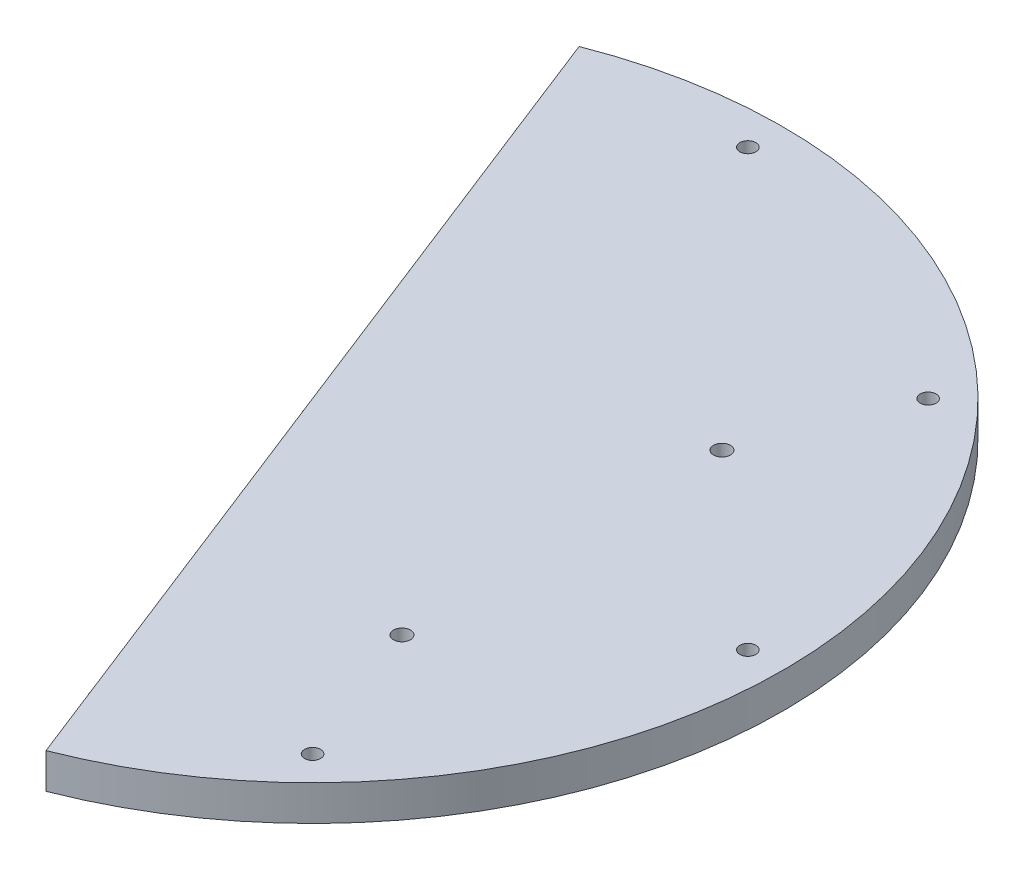
ISO-10303-21;
HEADER;
FILE_DESCRIPTION(('STEP AP214'),'2;1');
FILE_NAME('part.step','',(''),(''),'','','');
FILE_SCHEMA(('AUTOMOTIVE_DESIGN { 1 0 10303 214 1 1 1 1 }'));
ENDSEC;
DATA;
#1=APPLICATION_CONTEXT('core data for automotive mechanical design processes');
#2=APPLICATION_PROTOCOL_DEFINITION('international standard','automotive_design',2000,#1);
#3=PRODUCT_CONTEXT('',#1,'mechanical');
#4=PRODUCT('Part','Part','',(#3));
#5=PRODUCT_RELATED_PRODUCT_CATEGORY('part','',(#4));
#6=PRODUCT_DEFINITION_FORMATION('','',#4);
#7=PRODUCT_DEFINITION_CONTEXT('part definition',#1,'design');
#8=PRODUCT_DEFINITION('design','',#6,#7);
#9=PRODUCT_DEFINITION_SHAPE('','',#8);
#10=(LENGTH_UNIT() NAMED_UNIT(*) SI_UNIT(.MILLI.,.METRE.));
#11=(NAMED_UNIT(*) PLANE_ANGLE_UNIT() SI_UNIT($,.RADIAN.));
#12=(NAMED_UNIT(*) SI_UNIT($,.STERADIAN.) SOLID_ANGLE_UNIT());
#13=UNCERTAINTY_MEASURE_WITH_UNIT(LENGTH_MEASURE(1.E-05),#10,'distance_accuracy_value','');
#14=(GEOMETRIC_REPRESENTATION_CONTEXT(3) GLOBAL_UNCERTAINTY_ASSIGNED_CONTEXT((#13)) GLOBAL_UNIT_ASSIGNED_CONTEXT((#10,
#11,#12)) REPRESENTATION_CONTEXT('',''));
#15=CARTESIAN_POINT('',(0.,0.,0.));
#16=DIRECTION('',(0.,0.,1.));
#17=DIRECTION('',(1.,0.,0.));
#18=AXIS2_PLACEMENT_3D('',#15,#16,#17);
#19=CARTESIAN_POINT('',(0.,0.,0.));
#20=DIRECTION('',(0.,1.,0.));
#21=DIRECTION('',(0.,0.,1.));
#22=AXIS2_PLACEMENT_3D('',#19,#20,#21);
#23=PLANE('',#22);
#24=CARTESIAN_POINT('',(53.,0.,34.));
#25=DIRECTION('',(0.,-1.,0.));
#26=DIRECTION('',(0.,0.,-1.));
#27=AXIS2_PLACEMENT_3D('',#24,#25,#26);
#28=CIRCLE('',#27,3.25);
#29=CARTESIAN_POINT('',(53.,0.,30.75));
#30=VERTEX_POINT('',#29);
#31=EDGE_CURVE('E128',#30,#30,#28,.T.);
#32=ORIENTED_EDGE('',*,*,#31,.F.);
#33=EDGE_LOOP('',(#32));
#34=FACE_BOUND('',#33,.T.);
#35=CARTESIAN_POINT('',(-6.45005562586619E-13,0.,-92.5));
#36=DIRECTION('',(0.,-1.,0.));
#37=DIRECTION('',(0.,0.,-1.));
#38=AXIS2_PLACEMENT_3D('',#35,#36,#37);
#39=CIRCLE('',#38,3.25);
#40=CARTESIAN_POINT('',(-6.45005562586619E-13,0.,-95.75));
#41=VERTEX_POINT('',#40);
#42=EDGE_CURVE('E80',#41,#41,#39,.T.);
#43=ORIENTED_EDGE('',*,*,#42,.F.);
#44=EDGE_LOOP('',(#43));
#45=FACE_BOUND('',#44,.T.);
#46=CARTESIAN_POINT('',(65.4073772597553,0.,-65.407377259756));
#47=DIRECTION('',(0.,-1.,0.));
#48=DIRECTION('',(0.,0.,-1.));
#49=AXIS2_PLACEMENT_3D('',#46,#47,#48);
#50=CIRCLE('',#49,3.25);
#51=CARTESIAN_POINT('',(65.4073772597553,0.,-68.657377259756));
#52=VERTEX_POINT('',#51);
#53=EDGE_CURVE('E92',#52,#52,#50,.T.);
#54=ORIENTED_EDGE('',*,*,#53,.F.);
#55=EDGE_LOOP('',(#54));
#56=FACE_BOUND('',#55,.T.);
#57=CARTESIAN_POINT('',(92.5,0.,-3.22043538743629E-13));
#58=DIRECTION('',(0.,-1.,0.));
#59=DIRECTION('',(0.,0.,-1.));
#60=AXIS2_PLACEMENT_3D('',#57,#58,#59);
#61=CIRCLE('',#60,3.25);
#62=CARTESIAN_POINT('',(92.5,0.,-3.25000000000033));
#63=VERTEX_POINT('',#62);
#64=EDGE_CURVE('E104',#63,#63,#61,.T.);
#65=ORIENTED_EDGE('',*,*,#64,.F.);
#66=EDGE_LOOP('',(#65));
#67=FACE_BOUND('',#66,.T.);
#68=CARTESIAN_POINT('',(65.4073772597558,0.,65.4073772597555));
#69=DIRECTION('',(0.,-1.,0.));
#70=DIRECTION('',(0.,0.,-1.));
#71=AXIS2_PLACEMENT_3D('',#68,#69,#70);
#72=CIRCLE('',#71,3.25);
#73=CARTESIAN_POINT('',(65.4073772597558,0.,62.1573772597555));
#74=VERTEX_POINT('',#73);
#75=EDGE_CURVE('E116',#74,#74,#72,.T.);
#76=ORIENTED_EDGE('',*,*,#75,.F.);
#77=EDGE_LOOP('',(#76));
#78=FACE_BOUND('',#77,.T.);
#79=CARTESIAN_POINT('',(53.,0.,-34.));
#80=DIRECTION('',(0.,-1.,0.));
#81=DIRECTION('',(0.,0.,-1.));
#82=AXIS2_PLACEMENT_3D('',#79,#80,#81);
#83=CIRCLE('',#82,3.25);
#84=CARTESIAN_POINT('',(53.,0.,-37.25));
#85=VERTEX_POINT('',#84);
#86=EDGE_CURVE('E140',#85,#85,#83,.T.);
#87=ORIENTED_EDGE('',*,*,#86,.F.);
#88=EDGE_LOOP('',(#87));
#89=FACE_BOUND('',#88,.T.);
#90=DIRECTION('',(0.364698084371753,0.,0.931125827831864));
#91=VECTOR('',#90,1.);
#92=CARTESIAN_POINT('',(0.,0.,0.));
#93=LINE('',#92,#91);
#94=CARTESIAN_POINT('',(-36.4698084371753,0.,-93.1125827831864));
#95=VERTEX_POINT('',#94);
#96=CARTESIAN_POINT('',(36.4698084371753,0.,93.1125827831864));
#97=VERTEX_POINT('',#96);
#98=EDGE_CURVE('E66',#95,#97,#93,.T.);
#99=ORIENTED_EDGE('',*,*,#98,.F.);
#100=CARTESIAN_POINT('',(0.,0.,0.));
#101=DIRECTION('',(0.,1.,0.));
#102=DIRECTION('',(0.,0.,1.));
#103=AXIS2_PLACEMENT_3D('',#100,#101,#102);
#104=CIRCLE('',#103,100.);
#105=EDGE_CURVE('E65',#97,#95,#104,.T.);
#106=ORIENTED_EDGE('',*,*,#105,.F.);
#107=EDGE_LOOP('',(#99,#106));
#108=FACE_BOUND('',#107,.T.);
#109=ADVANCED_FACE('F33',(#34,#45,#56,#67,#78,#89,#108),#23,.F.);
#110=CARTESIAN_POINT('',(0.,7.5,0.));
#111=DIRECTION('',(0.,-1.,0.));
#112=DIRECTION('',(0.,0.,-1.));
#113=AXIS2_PLACEMENT_3D('',#110,#111,#112);
#114=CYLINDRICAL_SURFACE('',#113,100.);
#115=DIRECTION('',(0.,-1.,0.));
#116=VECTOR('',#115,1.);
#117=CARTESIAN_POINT('',(-36.4698084371753,7.5,-93.1125827831864));
#118=LINE('',#117,#116);
#119=CARTESIAN_POINT('',(-36.4698084371753,7.5,-93.1125827831864));
#120=VERTEX_POINT('',#119);
#121=EDGE_CURVE('E52',#120,#95,#118,.T.);
#122=ORIENTED_EDGE('',*,*,#121,.F.);
#123=CARTESIAN_POINT('',(0.,7.5,0.));
#124=DIRECTION('',(0.,1.,0.));
#125=DIRECTION('',(0.,0.,1.));
#126=AXIS2_PLACEMENT_3D('',#123,#124,#125);
#127=CIRCLE('',#126,100.);
#128=CARTESIAN_POINT('',(36.4698084371753,7.5,93.1125827831864));
#129=VERTEX_POINT('',#128);
#130=EDGE_CURVE('E41',#129,#120,#127,.T.);
#131=ORIENTED_EDGE('',*,*,#130,.F.);
#132=DIRECTION('',(0.,-1.,0.));
#133=VECTOR('',#132,1.);
#134=CARTESIAN_POINT('',(36.4698084371753,7.5,93.1125827831864));
#135=LINE('',#134,#133);
#136=EDGE_CURVE('E48',#97,#129,#135,.F.);
#137=ORIENTED_EDGE('',*,*,#136,.F.);
#138=ORIENTED_EDGE('',*,*,#105,.T.);
#139=EDGE_LOOP('',(#122,#131,#137,#138));
#140=FACE_BOUND('',#139,.T.);
#141=ADVANCED_FACE('F63',(#140),#114,.T.);
#142=CARTESIAN_POINT('',(0.,7.5,0.));
#143=DIRECTION('',(0.,1.,0.));
#144=DIRECTION('',(0.,0.,1.));
#145=AXIS2_PLACEMENT_3D('',#142,#143,#144);
#146=PLANE('',#145);
#147=CARTESIAN_POINT('',(-6.45005562586619E-13,7.5,-92.5));
#148=DIRECTION('',(0.,-1.,0.));
#149=DIRECTION('',(0.,0.,-1.));
#150=AXIS2_PLACEMENT_3D('',#147,#148,#149);
#151=CIRCLE('',#150,1.7);
#152=CARTESIAN_POINT('',(-6.45005562586619E-13,7.5,-94.2));
#153=VERTEX_POINT('',#152);
#154=EDGE_CURVE('E70',#153,#153,#151,.T.);
#155=ORIENTED_EDGE('',*,*,#154,.T.);
#156=EDGE_LOOP('',(#155));
#157=FACE_BOUND('',#156,.T.);
#158=CARTESIAN_POINT('',(65.4073772597553,7.5,-65.407377259756));
#159=DIRECTION('',(0.,-1.,0.));
#160=DIRECTION('',(0.,0.,-1.));
#161=AXIS2_PLACEMENT_3D('',#158,#159,#160);
#162=CIRCLE('',#161,1.69999999999999);
#163=CARTESIAN_POINT('',(65.4073772597553,7.5,-67.107377259756));
#164=VERTEX_POINT('',#163);
#165=EDGE_CURVE('E83',#164,#164,#162,.T.);
#166=ORIENTED_EDGE('',*,*,#165,.T.);
#167=EDGE_LOOP('',(#166));
#168=FACE_BOUND('',#167,.T.);
#169=CARTESIAN_POINT('',(92.5,7.5,-3.22043538743629E-13));
#170=DIRECTION('',(0.,-1.,0.));
#171=DIRECTION('',(0.,0.,-1.));
#172=AXIS2_PLACEMENT_3D('',#169,#170,#171);
#173=CIRCLE('',#172,1.69999999999999);
#174=CARTESIAN_POINT('',(92.5,7.5,-1.70000000000032));
#175=VERTEX_POINT('',#174);
#176=EDGE_CURVE('E95',#175,#175,#173,.T.);
#177=ORIENTED_EDGE('',*,*,#176,.T.);
#178=EDGE_LOOP('',(#177));
#179=FACE_BOUND('',#178,.T.);
#180=CARTESIAN_POINT('',(65.4073772597558,7.5,65.4073772597555));
#181=DIRECTION('',(0.,-1.,0.));
#182=DIRECTION('',(0.,0.,-1.));
#183=AXIS2_PLACEMENT_3D('',#180,#181,#182);
#184=CIRCLE('',#183,1.69999999999999);
#185=CARTESIAN_POINT('',(65.4073772597558,7.5,63.7073772597555));
#186=VERTEX_POINT('',#185);
#187=EDGE_CURVE('E107',#186,#186,#184,.T.);
#188=ORIENTED_EDGE('',*,*,#187,.T.);
#189=EDGE_LOOP('',(#188));
#190=FACE_BOUND('',#189,.T.);
#191=CARTESIAN_POINT('',(53.,7.5,34.));
#192=DIRECTION('',(0.,-1.,0.));
#193=DIRECTION('',(0.,0.,-1.));
#194=AXIS2_PLACEMENT_3D('',#191,#192,#193);
#195=CIRCLE('',#194,1.8);
#196=CARTESIAN_POINT('',(53.,7.5,32.2));
#197=VERTEX_POINT('',#196);
#198=EDGE_CURVE('E119',#197,#197,#195,.T.);
#199=ORIENTED_EDGE('',*,*,#198,.T.);
#200=EDGE_LOOP('',(#199));
#201=FACE_BOUND('',#200,.T.);
#202=CARTESIAN_POINT('',(53.,7.5,-34.));
#203=DIRECTION('',(0.,-1.,0.));
#204=DIRECTION('',(0.,0.,-1.));
#205=AXIS2_PLACEMENT_3D('',#202,#203,#204);
#206=CIRCLE('',#205,1.8);
#207=CARTESIAN_POINT('',(53.,7.5,-35.8));
#208=VERTEX_POINT('',#207);
#209=EDGE_CURVE('E131',#208,#208,#206,.T.);
#210=ORIENTED_EDGE('',*,*,#209,.T.);
#211=EDGE_LOOP('',(#210));
#212=FACE_BOUND('',#211,.T.);
#213=ORIENTED_EDGE('',*,*,#130,.T.);
#214=DIRECTION('',(0.364698084371753,0.,0.931125827831864));
#215=VECTOR('',#214,1.);
#216=CARTESIAN_POINT('',(0.,7.5,0.));
#217=LINE('',#216,#215);
#218=EDGE_CURVE('E11',#120,#129,#217,.T.);
#219=ORIENTED_EDGE('',*,*,#218,.T.);
#220=EDGE_LOOP('',(#213,#219));
#221=FACE_BOUND('',#220,.T.);
#222=ADVANCED_FACE('F68',(#157,#168,#179,#190,#201,#212,#221),#146,.T.);
#223=CARTESIAN_POINT('',(-6.45005562586619E-13,0.,-92.5));
#224=DIRECTION('',(0.,-1.,0.));
#225=DIRECTION('',(0.,0.,-1.));
#226=AXIS2_PLACEMENT_3D('',#223,#224,#225);
#227=CYLINDRICAL_SURFACE('',#226,1.7);
#228=ORIENTED_EDGE('',*,*,#154,.F.);
#229=EDGE_LOOP('',(#228));
#230=FACE_BOUND('',#229,.T.);
#231=CARTESIAN_POINT('',(-6.45005562586619E-13,3.,-92.5));
#232=DIRECTION('',(0.,-1.,0.));
#233=DIRECTION('',(0.,0.,-1.));
#234=AXIS2_PLACEMENT_3D('',#231,#232,#233);
#235=CIRCLE('',#234,1.7);
#236=CARTESIAN_POINT('',(-6.45005562586619E-13,3.,-94.2));
#237=VERTEX_POINT('',#236);
#238=EDGE_CURVE('E74',#237,#237,#235,.T.);
#239=ORIENTED_EDGE('',*,*,#238,.T.);
#240=EDGE_LOOP('',(#239));
#241=FACE_BOUND('',#240,.T.);
#242=ADVANCED_FACE('F253',(#230,#241),#227,.F.);
#243=CARTESIAN_POINT('',(1.69999999999935,3.,-92.5));
#244=DIRECTION('',(0.,1.,0.));
#245=DIRECTION('',(0.,0.,1.));
#246=AXIS2_PLACEMENT_3D('',#243,#244,#245);
#247=PLANE('',#246);
#248=ORIENTED_EDGE('',*,*,#238,.F.);
#249=EDGE_LOOP('',(#248));
#250=FACE_BOUND('',#249,.T.);
#251=CARTESIAN_POINT('',(-6.45005562586619E-13,3.,-92.5));
#252=DIRECTION('',(0.,-1.,0.));
#253=DIRECTION('',(0.,0.,-1.));
#254=AXIS2_PLACEMENT_3D('',#251,#252,#253);
#255=CIRCLE('',#254,3.25);
#256=CARTESIAN_POINT('',(-6.45005562586619E-13,3.,-95.75));
#257=VERTEX_POINT('',#256);
#258=EDGE_CURVE('E77',#257,#257,#255,.T.);
#259=ORIENTED_EDGE('',*,*,#258,.T.);
#260=EDGE_LOOP('',(#259));
#261=FACE_BOUND('',#260,.T.);
#262=ADVANCED_FACE('F396',(#250,#261),#247,.F.);
#263=CARTESIAN_POINT('',(-6.45005562586619E-13,0.,-92.5));
#264=DIRECTION('',(0.,-1.,0.));
#265=DIRECTION('',(0.,0.,-1.));
#266=AXIS2_PLACEMENT_3D('',#263,#264,#265);
#267=CYLINDRICAL_SURFACE('',#266,3.25);
#268=ORIENTED_EDGE('',*,*,#258,.F.);
#269=EDGE_LOOP('',(#268));
#270=FACE_BOUND('',#269,.T.);
#271=ORIENTED_EDGE('',*,*,#42,.T.);
#272=EDGE_LOOP('',(#271));
#273=FACE_BOUND('',#272,.T.);
#274=ADVANCED_FACE('F387',(#270,#273),#267,.F.);
#275=CARTESIAN_POINT('',(65.4073772597553,0.,-65.407377259756));
#276=DIRECTION('',(0.,-1.,0.));
#277=DIRECTION('',(0.,0.,-1.));
#278=AXIS2_PLACEMENT_3D('',#275,#276,#277);
#279=CYLINDRICAL_SURFACE('',#278,1.69999999999999);
#280=ORIENTED_EDGE('',*,*,#165,.F.);
#281=EDGE_LOOP('',(#280));
#282=FACE_BOUND('',#281,.T.);
#283=CARTESIAN_POINT('',(65.4073772597553,3.,-65.407377259756));
#284=DIRECTION('',(0.,-1.,0.));
#285=DIRECTION('',(0.,0.,-1.));
#286=AXIS2_PLACEMENT_3D('',#283,#284,#285);
#287=CIRCLE('',#286,1.69999999999999);
#288=CARTESIAN_POINT('',(65.4073772597553,3.,-67.107377259756));
#289=VERTEX_POINT('',#288);
#290=EDGE_CURVE('E86',#289,#289,#287,.T.);
#291=ORIENTED_EDGE('',*,*,#290,.T.);
#292=EDGE_LOOP('',(#291));
#293=FACE_BOUND('',#292,.T.);
#294=ADVANCED_FACE('F378',(#282,#293),#279,.F.);
#295=CARTESIAN_POINT('',(67.1073772597553,3.,-65.407377259756));
#296=DIRECTION('',(0.,1.,0.));
#297=DIRECTION('',(0.,0.,1.));
#298=AXIS2_PLACEMENT_3D('',#295,#296,#297);
#299=PLANE('',#298);
#300=ORIENTED_EDGE('',*,*,#290,.F.);
#301=EDGE_LOOP('',(#300));
#302=FACE_BOUND('',#301,.T.);
#303=CARTESIAN_POINT('',(65.4073772597553,3.,-65.407377259756));
#304=DIRECTION('',(0.,-1.,0.));
#305=DIRECTION('',(0.,0.,-1.));
#306=AXIS2_PLACEMENT_3D('',#303,#304,#305);
#307=CIRCLE('',#306,3.25);
#308=CARTESIAN_POINT('',(65.4073772597553,3.,-68.657377259756));
#309=VERTEX_POINT('',#308);
#310=EDGE_CURVE('E89',#309,#309,#307,.T.);
#311=ORIENTED_EDGE('',*,*,#310,.T.);
#312=EDGE_LOOP('',(#311));
#313=FACE_BOUND('',#312,.T.);
#314=ADVANCED_FACE('F369',(#302,#313),#299,.F.);
#315=CARTESIAN_POINT('',(65.4073772597553,0.,-65.407377259756));
#316=DIRECTION('',(0.,-1.,0.));
#317=DIRECTION('',(0.,0.,-1.));
#318=AXIS2_PLACEMENT_3D('',#315,#316,#317);
#319=CYLINDRICAL_SURFACE('',#318,3.25);
#320=ORIENTED_EDGE('',*,*,#310,.F.);
#321=EDGE_LOOP('',(#320));
#322=FACE_BOUND('',#321,.T.);
#323=ORIENTED_EDGE('',*,*,#53,.T.);
#324=EDGE_LOOP('',(#323));
#325=FACE_BOUND('',#324,.T.);
#326=ADVANCED_FACE('F360',(#322,#325),#319,.F.);
#327=CARTESIAN_POINT('',(92.5,0.,-3.22043538743629E-13));
#328=DIRECTION('',(0.,-1.,0.));
#329=DIRECTION('',(0.,0.,-1.));
#330=AXIS2_PLACEMENT_3D('',#327,#328,#329);
#331=CYLINDRICAL_SURFACE('',#330,1.69999999999999);
#332=ORIENTED_EDGE('',*,*,#176,.F.);
#333=EDGE_LOOP('',(#332));
#334=FACE_BOUND('',#333,.T.);
#335=CARTESIAN_POINT('',(92.5,3.,-3.22043538743629E-13));
#336=DIRECTION('',(0.,-1.,0.));
#337=DIRECTION('',(0.,0.,-1.));
#338=AXIS2_PLACEMENT_3D('',#335,#336,#337);
#339=CIRCLE('',#338,1.69999999999999);
#340=CARTESIAN_POINT('',(92.5,3.,-1.70000000000032));
#341=VERTEX_POINT('',#340);
#342=EDGE_CURVE('E98',#341,#341,#339,.T.);
#343=ORIENTED_EDGE('',*,*,#342,.T.);
#344=EDGE_LOOP('',(#343));
#345=FACE_BOUND('',#344,.T.);
#346=ADVANCED_FACE('F351',(#334,#345),#331,.F.);
#347=CARTESIAN_POINT('',(94.2,3.,-3.22043538743629E-13));
#348=DIRECTION('',(0.,1.,0.));
#349=DIRECTION('',(0.,0.,1.));
#350=AXIS2_PLACEMENT_3D('',#347,#348,#349);
#351=PLANE('',#350);
#352=ORIENTED_EDGE('',*,*,#342,.F.);
#353=EDGE_LOOP('',(#352));
#354=FACE_BOUND('',#353,.T.);
#355=CARTESIAN_POINT('',(92.5,3.,-3.22043538743629E-13));
#356=DIRECTION('',(0.,-1.,0.));
#357=DIRECTION('',(0.,0.,-1.));
#358=AXIS2_PLACEMENT_3D('',#355,#356,#357);
#359=CIRCLE('',#358,3.25);
#360=CARTESIAN_POINT('',(92.5,3.,-3.25000000000033));
#361=VERTEX_POINT('',#360);
#362=EDGE_CURVE('E101',#361,#361,#359,.T.);
#363=ORIENTED_EDGE('',*,*,#362,.T.);
#364=EDGE_LOOP('',(#363));
#365=FACE_BOUND('',#364,.T.);
#366=ADVANCED_FACE('F342',(#354,#365),#351,.F.);
#367=CARTESIAN_POINT('',(92.5,0.,-3.22043538743629E-13));
#368=DIRECTION('',(0.,-1.,0.));
#369=DIRECTION('',(0.,0.,-1.));
#370=AXIS2_PLACEMENT_3D('',#367,#368,#369);
#371=CYLINDRICAL_SURFACE('',#370,3.25);
#372=ORIENTED_EDGE('',*,*,#362,.F.);
#373=EDGE_LOOP('',(#372));
#374=FACE_BOUND('',#373,.T.);
#375=ORIENTED_EDGE('',*,*,#64,.T.);
#376=EDGE_LOOP('',(#375));
#377=FACE_BOUND('',#376,.T.);
#378=ADVANCED_FACE('F333',(#374,#377),#371,.F.);
#379=CARTESIAN_POINT('',(65.4073772597558,0.,65.4073772597555));
#380=DIRECTION('',(0.,-1.,0.));
#381=DIRECTION('',(0.,0.,-1.));
#382=AXIS2_PLACEMENT_3D('',#379,#380,#381);
#383=CYLINDRICAL_SURFACE('',#382,1.69999999999999);
#384=ORIENTED_EDGE('',*,*,#187,.F.);
#385=EDGE_LOOP('',(#384));
#386=FACE_BOUND('',#385,.T.);
#387=CARTESIAN_POINT('',(65.4073772597558,3.,65.4073772597555));
#388=DIRECTION('',(0.,-1.,0.));
#389=DIRECTION('',(0.,0.,-1.));
#390=AXIS2_PLACEMENT_3D('',#387,#388,#389);
#391=CIRCLE('',#390,1.69999999999999);
#392=CARTESIAN_POINT('',(65.4073772597558,3.,63.7073772597555));
#393=VERTEX_POINT('',#392);
#394=EDGE_CURVE('E110',#393,#393,#391,.T.);
#395=ORIENTED_EDGE('',*,*,#394,.T.);
#396=EDGE_LOOP('',(#395));
#397=FACE_BOUND('',#396,.T.);
#398=ADVANCED_FACE('F324',(#386,#397),#383,.F.);
#399=CARTESIAN_POINT('',(67.1073772597558,3.,65.4073772597555));
#400=DIRECTION('',(0.,1.,0.));
#401=DIRECTION('',(0.,0.,1.));
#402=AXIS2_PLACEMENT_3D('',#399,#400,#401);
#403=PLANE('',#402);
#404=ORIENTED_EDGE('',*,*,#394,.F.);
#405=EDGE_LOOP('',(#404));
#406=FACE_BOUND('',#405,.T.);
#407=CARTESIAN_POINT('',(65.4073772597558,3.,65.4073772597555));
#408=DIRECTION('',(0.,-1.,0.));
#409=DIRECTION('',(0.,0.,-1.));
#410=AXIS2_PLACEMENT_3D('',#407,#408,#409);
#411=CIRCLE('',#410,3.25);
#412=CARTESIAN_POINT('',(65.4073772597558,3.,62.1573772597555));
#413=VERTEX_POINT('',#412);
#414=EDGE_CURVE('E113',#413,#413,#411,.T.);
#415=ORIENTED_EDGE('',*,*,#414,.T.);
#416=EDGE_LOOP('',(#415));
#417=FACE_BOUND('',#416,.T.);
#418=ADVANCED_FACE('F315',(#406,#417),#403,.F.);
#419=CARTESIAN_POINT('',(65.4073772597558,0.,65.4073772597555));
#420=DIRECTION('',(0.,-1.,0.));
#421=DIRECTION('',(0.,0.,-1.));
#422=AXIS2_PLACEMENT_3D('',#419,#420,#421);
#423=CYLINDRICAL_SURFACE('',#422,3.25);
#424=ORIENTED_EDGE('',*,*,#414,.F.);
#425=EDGE_LOOP('',(#424));
#426=FACE_BOUND('',#425,.T.);
#427=ORIENTED_EDGE('',*,*,#75,.T.);
#428=EDGE_LOOP('',(#427));
#429=FACE_BOUND('',#428,.T.);
#430=ADVANCED_FACE('F306',(#426,#429),#423,.F.);
#431=CARTESIAN_POINT('',(53.,0.,34.));
#432=DIRECTION('',(0.,-1.,0.));
#433=DIRECTION('',(0.,0.,-1.));
#434=AXIS2_PLACEMENT_3D('',#431,#432,#433);
#435=CYLINDRICAL_SURFACE('',#434,1.8);
#436=ORIENTED_EDGE('',*,*,#198,.F.);
#437=EDGE_LOOP('',(#436));
#438=FACE_BOUND('',#437,.T.);
#439=CARTESIAN_POINT('',(53.,3.,34.));
#440=DIRECTION('',(0.,-1.,0.));
#441=DIRECTION('',(0.,0.,-1.));
#442=AXIS2_PLACEMENT_3D('',#439,#440,#441);
#443=CIRCLE('',#442,1.8);
#444=CARTESIAN_POINT('',(53.,3.,32.2));
#445=VERTEX_POINT('',#444);
#446=EDGE_CURVE('E122',#445,#445,#443,.T.);
#447=ORIENTED_EDGE('',*,*,#446,.T.);
#448=EDGE_LOOP('',(#447));
#449=FACE_BOUND('',#448,.T.);
#450=ADVANCED_FACE('F297',(#438,#449),#435,.F.);
#451=CARTESIAN_POINT('',(54.8,3.,34.));
#452=DIRECTION('',(0.,1.,0.));
#453=DIRECTION('',(0.,0.,1.));
#454=AXIS2_PLACEMENT_3D('',#451,#452,#453);
#455=PLANE('',#454);
#456=ORIENTED_EDGE('',*,*,#446,.F.);
#457=EDGE_LOOP('',(#456));
#458=FACE_BOUND('',#457,.T.);
#459=CARTESIAN_POINT('',(53.,3.,34.));
#460=DIRECTION('',(0.,-1.,0.));
#461=DIRECTION('',(0.,0.,-1.));
#462=AXIS2_PLACEMENT_3D('',#459,#460,#461);
#463=CIRCLE('',#462,3.25);
#464=CARTESIAN_POINT('',(53.,3.,30.75));
#465=VERTEX_POINT('',#464);
#466=EDGE_CURVE('E125',#465,#465,#463,.T.);
#467=ORIENTED_EDGE('',*,*,#466,.T.);
#468=EDGE_LOOP('',(#467));
#469=FACE_BOUND('',#468,.T.);
#470=ADVANCED_FACE('F288',(#458,#469),#455,.F.);
#471=CARTESIAN_POINT('',(53.,0.,34.));
#472=DIRECTION('',(0.,-1.,0.));
#473=DIRECTION('',(0.,0.,-1.));
#474=AXIS2_PLACEMENT_3D('',#471,#472,#473);
#475=CYLINDRICAL_SURFACE('',#474,3.25);
#476=ORIENTED_EDGE('',*,*,#466,.F.);
#477=EDGE_LOOP('',(#476));
#478=FACE_BOUND('',#477,.T.);
#479=ORIENTED_EDGE('',*,*,#31,.T.);
#480=EDGE_LOOP('',(#479));
#481=FACE_BOUND('',#480,.T.);
#482=ADVANCED_FACE('F279',(#478,#481),#475,.F.);
#483=CARTESIAN_POINT('',(53.,0.,-34.));
#484=DIRECTION('',(0.,-1.,0.));
#485=DIRECTION('',(0.,0.,-1.));
#486=AXIS2_PLACEMENT_3D('',#483,#484,#485);
#487=CYLINDRICAL_SURFACE('',#486,1.8);
#488=ORIENTED_EDGE('',*,*,#209,.F.);
#489=EDGE_LOOP('',(#488));
#490=FACE_BOUND('',#489,.T.);
#491=CARTESIAN_POINT('',(53.,3.,-34.));
#492=DIRECTION('',(0.,-1.,0.));
#493=DIRECTION('',(0.,0.,-1.));
#494=AXIS2_PLACEMENT_3D('',#491,#492,#493);
#495=CIRCLE('',#494,1.8);
#496=CARTESIAN_POINT('',(53.,3.,-35.8));
#497=VERTEX_POINT('',#496);
#498=EDGE_CURVE('E134',#497,#497,#495,.T.);
#499=ORIENTED_EDGE('',*,*,#498,.T.);
#500=EDGE_LOOP('',(#499));
#501=FACE_BOUND('',#500,.T.);
#502=ADVANCED_FACE('F270',(#490,#501),#487,.F.);
#503=CARTESIAN_POINT('',(54.8,3.,-34.));
#504=DIRECTION('',(0.,1.,0.));
#505=DIRECTION('',(0.,0.,1.));
#506=AXIS2_PLACEMENT_3D('',#503,#504,#505);
#507=PLANE('',#506);
#508=ORIENTED_EDGE('',*,*,#498,.F.);
#509=EDGE_LOOP('',(#508));
#510=FACE_BOUND('',#509,.T.);
#511=CARTESIAN_POINT('',(53.,3.,-34.));
#512=DIRECTION('',(0.,-1.,0.));
#513=DIRECTION('',(0.,0.,-1.));
#514=AXIS2_PLACEMENT_3D('',#511,#512,#513);
#515=CIRCLE('',#514,3.25);
#516=CARTESIAN_POINT('',(53.,3.,-37.25));
#517=VERTEX_POINT('',#516);
#518=EDGE_CURVE('E137',#517,#517,#515,.T.);
#519=ORIENTED_EDGE('',*,*,#518,.T.);
#520=EDGE_LOOP('',(#519));
#521=FACE_BOUND('',#520,.T.);
#522=ADVANCED_FACE('F261',(#510,#521),#507,.F.);
#523=CARTESIAN_POINT('',(53.,0.,-34.));
#524=DIRECTION('',(0.,-1.,0.));
#525=DIRECTION('',(0.,0.,-1.));
#526=AXIS2_PLACEMENT_3D('',#523,#524,#525);
#527=CYLINDRICAL_SURFACE('',#526,3.25);
#528=ORIENTED_EDGE('',*,*,#518,.F.);
#529=EDGE_LOOP('',(#528));
#530=FACE_BOUND('',#529,.T.);
#531=ORIENTED_EDGE('',*,*,#86,.T.);
#532=EDGE_LOOP('',(#531));
#533=FACE_BOUND('',#532,.T.);
#534=ADVANCED_FACE('F166',(#530,#533),#527,.F.);
#535=CARTESIAN_POINT('',(0.,0.,0.));
#536=DIRECTION('',(-0.931125827831864,0.,0.364698084371753));
#537=DIRECTION('',(0.364698084371753,0.,0.931125827831864));
#538=AXIS2_PLACEMENT_3D('',#535,#536,#537);
#539=PLANE('',#538);
#540=CARTESIAN_POINT('',(14.5879233748701,3.74999999999972,37.2450331132745));
#541=DIRECTION('',(-0.931125827831864,0.,0.364698084371753));
#542=DIRECTION('',(-0.364698084371753,0.,-0.931125827831864));
#543=AXIS2_PLACEMENT_3D('',#540,#541,#542);
#544=CIRCLE('',#543,1.87499999999999);
#545=CARTESIAN_POINT('',(13.9041144666731,3.74999999999972,35.4991721860898));
#546=VERTEX_POINT('',#545);
#547=EDGE_CURVE('E157',#546,#546,#544,.T.);
#548=ORIENTED_EDGE('',*,*,#547,.F.);
#549=EDGE_LOOP('',(#548));
#550=FACE_BOUND('',#549,.T.);
#551=CARTESIAN_POINT('',(29.1758467497403,3.74999999999944,74.4900662265491));
#552=DIRECTION('',(-0.931125827831864,0.,0.364698084371753));
#553=DIRECTION('',(-0.364698084371753,0.,-0.931125827831864));
#554=AXIS2_PLACEMENT_3D('',#551,#552,#553);
#555=CIRCLE('',#554,1.875);
#556=CARTESIAN_POINT('',(28.4920378415432,3.74999999999944,72.7442052993643));
#557=VERTEX_POINT('',#556);
#558=EDGE_CURVE('E154',#557,#557,#555,.T.);
#559=ORIENTED_EDGE('',*,*,#558,.F.);
#560=EDGE_LOOP('',(#559));
#561=FACE_BOUND('',#560,.T.);
#562=CARTESIAN_POINT('',(-29.1758467497403,3.74999999999944,-74.4900662265491));
#563=DIRECTION('',(-0.931125827831864,0.,0.364698084371753));
#564=DIRECTION('',(0.364698084371753,0.,0.931125827831864));
#565=AXIS2_PLACEMENT_3D('',#562,#563,#564);
#566=CIRCLE('',#565,1.875);
#567=CARTESIAN_POINT('',(-28.4920378415432,3.74999999999944,-72.7442052993643));
#568=VERTEX_POINT('',#567);
#569=EDGE_CURVE('E151',#568,#568,#566,.T.);
#570=ORIENTED_EDGE('',*,*,#569,.F.);
#571=EDGE_LOOP('',(#570));
#572=FACE_BOUND('',#571,.T.);
#573=CARTESIAN_POINT('',(-14.5879233748701,3.74999999999972,-37.2450331132745));
#574=DIRECTION('',(-0.931125827831864,0.,0.364698084371753));
#575=DIRECTION('',(0.364698084371753,0.,0.931125827831864));
#576=AXIS2_PLACEMENT_3D('',#573,#574,#575);
#577=CIRCLE('',#576,1.87499999999999);
#578=CARTESIAN_POINT('',(-13.9041144666731,3.74999999999972,-35.4991721860898));
#579=VERTEX_POINT('',#578);
#580=EDGE_CURVE('E148',#579,#579,#577,.T.);
#581=ORIENTED_EDGE('',*,*,#580,.F.);
#582=EDGE_LOOP('',(#581));
#583=FACE_BOUND('',#582,.T.);
#584=CARTESIAN_POINT('',(0.,3.75,0.));
#585=DIRECTION('',(-0.931125827831864,0.,0.364698084371753));
#586=DIRECTION('',(0.364698084371753,0.,0.931125827831864));
#587=AXIS2_PLACEMENT_3D('',#584,#585,#586);
#588=CIRCLE('',#587,1.875);
#589=CARTESIAN_POINT('',(0.683808908197037,3.75,1.74586092718474));
#590=VERTEX_POINT('',#589);
#591=EDGE_CURVE('E145',#590,#590,#588,.T.);
#592=ORIENTED_EDGE('',*,*,#591,.F.);
#593=EDGE_LOOP('',(#592));
#594=FACE_BOUND('',#593,.T.);
#595=ORIENTED_EDGE('',*,*,#98,.T.);
#596=ORIENTED_EDGE('',*,*,#136,.T.);
#597=ORIENTED_EDGE('',*,*,#218,.F.);
#598=ORIENTED_EDGE('',*,*,#121,.T.);
#599=EDGE_LOOP('',(#595,#596,#597,#598));
#600=FACE_BOUND('',#599,.T.);
#601=ADVANCED_FACE('F57',(#550,#561,#572,#583,#594,#600),#539,.T.);
#602=CARTESIAN_POINT('',(-29.1758467497403,3.74999999999944,-74.4900662265491));
#603=DIRECTION('',(-0.931125827831864,0.,0.364698084371753));
#604=DIRECTION('',(0.364698084371753,0.,0.931125827831864));
#605=AXIS2_PLACEMENT_3D('',#602,#603,#604);
#606=SPHERICAL_SURFACE('',#605,1.875);
#607=ORIENTED_EDGE('',*,*,#569,.T.);
#608=EDGE_LOOP('',(#607));
#609=FACE_BOUND('',#608,.T.);
#610=ADVANCED_FACE('F165',(#609),#606,.T.);
#611=CARTESIAN_POINT('',(-14.5879233748701,3.74999999999972,-37.2450331132745));
#612=DIRECTION('',(-0.931125827831864,0.,0.364698084371753));
#613=DIRECTION('',(0.364698084371753,0.,0.931125827831864));
#614=AXIS2_PLACEMENT_3D('',#611,#612,#613);
#615=SPHERICAL_SURFACE('',#614,1.875);
#616=ORIENTED_EDGE('',*,*,#580,.T.);
#617=EDGE_LOOP('',(#616));
#618=FACE_BOUND('',#617,.T.);
#619=ADVANCED_FACE('F178',(#618),#615,.T.);
#620=CARTESIAN_POINT('',(0.,3.75,0.));
#621=DIRECTION('',(-0.931125827831864,0.,0.364698084371753));
#622=DIRECTION('',(0.364698084371753,0.,0.931125827831864));
#623=AXIS2_PLACEMENT_3D('',#620,#621,#622);
#624=SPHERICAL_SURFACE('',#623,1.875);
#625=ORIENTED_EDGE('',*,*,#591,.T.);
#626=EDGE_LOOP('',(#625));
#627=FACE_BOUND('',#626,.T.);
#628=ADVANCED_FACE('F176',(#627),#624,.T.);
#629=CARTESIAN_POINT('',(14.5879233748701,3.74999999999972,37.2450331132745));
#630=DIRECTION('',(0.931125827831864,0.,-0.364698084371753));
#631=DIRECTION('',(-0.364698084371753,0.,-0.931125827831864));
#632=AXIS2_PLACEMENT_3D('',#629,#630,#631);
#633=SPHERICAL_SURFACE('',#632,1.875);
#634=ORIENTED_EDGE('',*,*,#547,.T.);
#635=EDGE_LOOP('',(#634));
#636=FACE_BOUND('',#635,.T.);
#637=ADVANCED_FACE('F161',(#636),#633,.T.);
#638=CARTESIAN_POINT('',(29.1758467497403,3.74999999999944,74.4900662265491));
#639=DIRECTION('',(0.931125827831864,0.,-0.364698084371753));
#640=DIRECTION('',(-0.364698084371753,0.,-0.931125827831864));
#641=AXIS2_PLACEMENT_3D('',#638,#639,#640);
#642=SPHERICAL_SURFACE('',#641,1.875);
#643=ORIENTED_EDGE('',*,*,#558,.T.);
#644=EDGE_LOOP('',(#643));
#645=FACE_BOUND('',#644,.T.);
#646=ADVANCED_FACE('F35',(#645),#642,.T.);
#647=CLOSED_SHELL('',(#109,#141,#222,#242,#262,#274,#294,#314,#326,#346,#366,#378,#398,#418,
#430,#450,#470,#482,#502,#522,#534,#601,#610,#619,#628,#637,#646));
#648=MANIFOLD_SOLID_BREP('B2',#647);
#649=ADVANCED_BREP_SHAPE_REPRESENTATION('',(#18,#648),#14);
#650=SHAPE_DEFINITION_REPRESENTATION(#9,#649);
ENDSEC;
END-ISO-10303-21;
